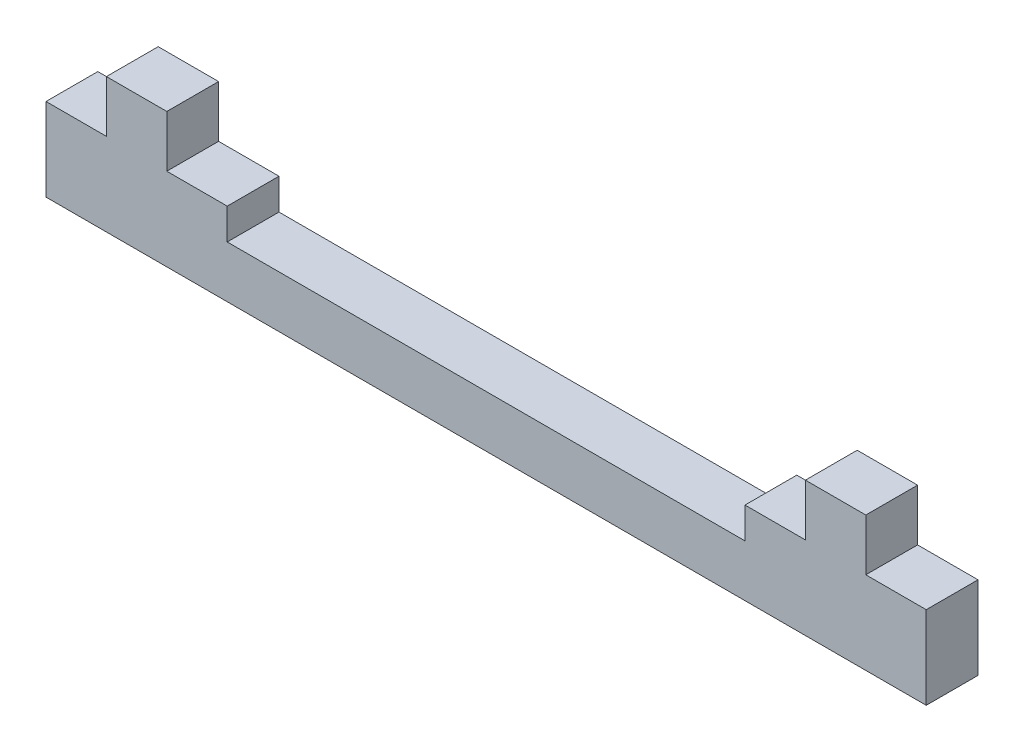
ISO-10303-21;
HEADER;
FILE_DESCRIPTION(('STEP AP214'),'2;1');
FILE_NAME('part.step','',(''),(''),'','','');
FILE_SCHEMA(('AUTOMOTIVE_DESIGN { 1 0 10303 214 1 1 1 1 }'));
ENDSEC;
DATA;
#1=APPLICATION_CONTEXT('core data for automotive mechanical design processes');
#2=APPLICATION_PROTOCOL_DEFINITION('international standard','automotive_design',2000,#1);
#3=PRODUCT_CONTEXT('',#1,'mechanical');
#4=PRODUCT('Part','Part','',(#3));
#5=PRODUCT_RELATED_PRODUCT_CATEGORY('part','',(#4));
#6=PRODUCT_DEFINITION_FORMATION('','',#4);
#7=PRODUCT_DEFINITION_CONTEXT('part definition',#1,'design');
#8=PRODUCT_DEFINITION('design','',#6,#7);
#9=PRODUCT_DEFINITION_SHAPE('','',#8);
#10=(LENGTH_UNIT() NAMED_UNIT(*) SI_UNIT(.MILLI.,.METRE.));
#11=(NAMED_UNIT(*) PLANE_ANGLE_UNIT() SI_UNIT($,.RADIAN.));
#12=(NAMED_UNIT(*) SI_UNIT($,.STERADIAN.) SOLID_ANGLE_UNIT());
#13=UNCERTAINTY_MEASURE_WITH_UNIT(LENGTH_MEASURE(1.E-05),#10,'distance_accuracy_value','');
#14=(GEOMETRIC_REPRESENTATION_CONTEXT(3) GLOBAL_UNCERTAINTY_ASSIGNED_CONTEXT((#13)) GLOBAL_UNIT_ASSIGNED_CONTEXT((#10,
#11,#12)) REPRESENTATION_CONTEXT('',''));
#15=CARTESIAN_POINT('',(0.,0.,0.));
#16=DIRECTION('',(0.,0.,1.));
#17=DIRECTION('',(1.,0.,0.));
#18=AXIS2_PLACEMENT_3D('',#15,#16,#17);
#19=CARTESIAN_POINT('',(-42.5,6.5,5.));
#20=DIRECTION('',(0.,-1.,0.));
#21=DIRECTION('',(0.,0.,-1.));
#22=AXIS2_PLACEMENT_3D('',#19,#20,#21);
#23=PLANE('',#22);
#24=DIRECTION('',(-1.,0.,0.));
#25=VECTOR('',#24,1.);
#26=CARTESIAN_POINT('',(-42.5,6.5,5.));
#27=LINE('',#26,#25);
#28=CARTESIAN_POINT('',(36.666667,6.5,5.));
#29=VERTEX_POINT('',#28);
#30=CARTESIAN_POINT('',(30.833334,6.5,5.));
#31=VERTEX_POINT('',#30);
#32=EDGE_CURVE('E188',#29,#31,#27,.T.);
#33=ORIENTED_EDGE('',*,*,#32,.F.);
#34=DIRECTION('',(0.,0.,-1.));
#35=VECTOR('',#34,1.);
#36=CARTESIAN_POINT('',(36.666667,6.5,5.));
#37=LINE('',#36,#35);
#38=CARTESIAN_POINT('',(36.666667,6.5,0.));
#39=VERTEX_POINT('',#38);
#40=EDGE_CURVE('E229',#29,#39,#37,.T.);
#41=ORIENTED_EDGE('',*,*,#40,.T.);
#42=DIRECTION('',(-1.,0.,0.));
#43=VECTOR('',#42,1.);
#44=CARTESIAN_POINT('',(-42.5,6.5,0.));
#45=LINE('',#44,#43);
#46=CARTESIAN_POINT('',(30.833334,6.5,0.));
#47=VERTEX_POINT('',#46);
#48=EDGE_CURVE('E208',#39,#47,#45,.T.);
#49=ORIENTED_EDGE('',*,*,#48,.T.);
#50=DIRECTION('',(0.,0.,-1.));
#51=VECTOR('',#50,1.);
#52=CARTESIAN_POINT('',(30.833334,6.5,5.));
#53=LINE('',#52,#51);
#54=EDGE_CURVE('E225',#31,#47,#53,.T.);
#55=ORIENTED_EDGE('',*,*,#54,.F.);
#56=EDGE_LOOP('',(#33,#41,#49,#55));
#57=FACE_BOUND('',#56,.T.);
#58=ADVANCED_FACE('F43',(#57),#23,.F.);
#59=CARTESIAN_POINT('',(-30.833334,6.5,5.));
#60=VERTEX_POINT('',#59);
#61=CARTESIAN_POINT('',(-36.666667,6.5,5.));
#62=VERTEX_POINT('',#61);
#63=EDGE_CURVE('E182',#60,#62,#27,.T.);
#64=ORIENTED_EDGE('',*,*,#63,.F.);
#65=DIRECTION('',(0.,0.,-1.));
#66=VECTOR('',#65,1.);
#67=CARTESIAN_POINT('',(-30.833334,6.5,5.));
#68=LINE('',#67,#66);
#69=CARTESIAN_POINT('',(-30.833334,6.5,0.));
#70=VERTEX_POINT('',#69);
#71=EDGE_CURVE('E262',#60,#70,#68,.T.);
#72=ORIENTED_EDGE('',*,*,#71,.T.);
#73=CARTESIAN_POINT('',(-36.666667,6.5,0.));
#74=VERTEX_POINT('',#73);
#75=EDGE_CURVE('E203',#70,#74,#45,.T.);
#76=ORIENTED_EDGE('',*,*,#75,.T.);
#77=DIRECTION('',(0.,0.,-1.));
#78=VECTOR('',#77,1.);
#79=CARTESIAN_POINT('',(-36.666667,6.5,5.));
#80=LINE('',#79,#78);
#81=EDGE_CURVE('E282',#62,#74,#80,.T.);
#82=ORIENTED_EDGE('',*,*,#81,.F.);
#83=EDGE_LOOP('',(#64,#72,#76,#82));
#84=FACE_BOUND('',#83,.T.);
#85=ADVANCED_FACE('F352',(#84),#23,.F.);
#86=CARTESIAN_POINT('',(-42.5,6.5,5.));
#87=DIRECTION('',(1.,0.,0.));
#88=DIRECTION('',(0.,0.,-1.));
#89=AXIS2_PLACEMENT_3D('',#86,#87,#88);
#90=PLANE('',#89);
#91=DIRECTION('',(0.,0.,-1.));
#92=VECTOR('',#91,1.);
#93=CARTESIAN_POINT('',(-42.5,1.5,5.));
#94=LINE('',#93,#92);
#95=CARTESIAN_POINT('',(-42.5,1.5,5.));
#96=VERTEX_POINT('',#95);
#97=CARTESIAN_POINT('',(-42.5,1.5,0.));
#98=VERTEX_POINT('',#97);
#99=EDGE_CURVE('E285',#96,#98,#94,.T.);
#100=ORIENTED_EDGE('',*,*,#99,.T.);
#101=DIRECTION('',(0.,-1.,0.));
#102=VECTOR('',#101,1.);
#103=CARTESIAN_POINT('',(-42.5,6.5,0.));
#104=LINE('',#103,#102);
#105=CARTESIAN_POINT('',(-42.5,-6.5,0.));
#106=VERTEX_POINT('',#105);
#107=EDGE_CURVE('E190',#98,#106,#104,.T.);
#108=ORIENTED_EDGE('',*,*,#107,.T.);
#109=DIRECTION('',(0.,0.,-1.));
#110=VECTOR('',#109,1.);
#111=CARTESIAN_POINT('',(-42.5,-6.5,5.));
#112=LINE('',#111,#110);
#113=CARTESIAN_POINT('',(-42.5,-6.5,5.));
#114=VERTEX_POINT('',#113);
#115=EDGE_CURVE('E11',#114,#106,#112,.T.);
#116=ORIENTED_EDGE('',*,*,#115,.F.);
#117=DIRECTION('',(0.,-1.,0.));
#118=VECTOR('',#117,1.);
#119=CARTESIAN_POINT('',(-42.5,6.5,5.));
#120=LINE('',#119,#118);
#121=EDGE_CURVE('E196',#96,#114,#120,.T.);
#122=ORIENTED_EDGE('',*,*,#121,.F.);
#123=EDGE_LOOP('',(#100,#108,#116,#122));
#124=FACE_BOUND('',#123,.T.);
#125=ADVANCED_FACE('F360',(#124),#90,.F.);
#126=CARTESIAN_POINT('',(0.,0.,5.));
#127=DIRECTION('',(0.,0.,1.));
#128=DIRECTION('',(1.,0.,0.));
#129=AXIS2_PLACEMENT_3D('',#126,#127,#128);
#130=PLANE('',#129);
#131=DIRECTION('',(0.,1.,0.));
#132=VECTOR('',#131,1.);
#133=CARTESIAN_POINT('',(36.666667,0.,5.));
#134=LINE('',#133,#132);
#135=CARTESIAN_POINT('',(36.666667,1.5,5.));
#136=VERTEX_POINT('',#135);
#137=EDGE_CURVE('E165',#136,#29,#134,.T.);
#138=ORIENTED_EDGE('',*,*,#137,.T.);
#139=ORIENTED_EDGE('',*,*,#32,.T.);
#140=DIRECTION('',(0.,1.,0.));
#141=VECTOR('',#140,1.);
#142=CARTESIAN_POINT('',(30.833334,0.,5.));
#143=LINE('',#142,#141);
#144=CARTESIAN_POINT('',(30.833334,1.5,5.));
#145=VERTEX_POINT('',#144);
#146=EDGE_CURVE('E245',#145,#31,#143,.T.);
#147=ORIENTED_EDGE('',*,*,#146,.F.);
#148=DIRECTION('',(-1.,0.,0.));
#149=VECTOR('',#148,1.);
#150=CARTESIAN_POINT('',(0.,1.5,5.));
#151=LINE('',#150,#149);
#152=CARTESIAN_POINT('',(25.,1.5,5.));
#153=VERTEX_POINT('',#152);
#154=EDGE_CURVE('E236',#145,#153,#151,.T.);
#155=ORIENTED_EDGE('',*,*,#154,.T.);
#156=DIRECTION('',(0.,1.,0.));
#157=VECTOR('',#156,1.);
#158=CARTESIAN_POINT('',(25.,1.5,5.));
#159=LINE('',#158,#157);
#160=CARTESIAN_POINT('',(25.,-1.5,5.));
#161=VERTEX_POINT('',#160);
#162=EDGE_CURVE('E296',#161,#153,#159,.T.);
#163=ORIENTED_EDGE('',*,*,#162,.F.);
#164=DIRECTION('',(1.,0.,0.));
#165=VECTOR('',#164,1.);
#166=CARTESIAN_POINT('',(-25.,-1.5,5.));
#167=LINE('',#166,#165);
#168=CARTESIAN_POINT('',(-25.,-1.5,5.));
#169=VERTEX_POINT('',#168);
#170=EDGE_CURVE('E306',#169,#161,#167,.T.);
#171=ORIENTED_EDGE('',*,*,#170,.F.);
#172=DIRECTION('',(0.,-1.,0.));
#173=VECTOR('',#172,1.);
#174=CARTESIAN_POINT('',(-25.,1.5,5.));
#175=LINE('',#174,#173);
#176=CARTESIAN_POINT('',(-25.,1.5,5.));
#177=VERTEX_POINT('',#176);
#178=EDGE_CURVE('E233',#177,#169,#175,.T.);
#179=ORIENTED_EDGE('',*,*,#178,.F.);
#180=CARTESIAN_POINT('',(-30.833334,1.5,5.));
#181=VERTEX_POINT('',#180);
#182=EDGE_CURVE('E241',#177,#181,#151,.T.);
#183=ORIENTED_EDGE('',*,*,#182,.T.);
#184=DIRECTION('',(0.,1.,0.));
#185=VECTOR('',#184,1.);
#186=CARTESIAN_POINT('',(-30.833334,0.,5.));
#187=LINE('',#186,#185);
#188=EDGE_CURVE('E240',#181,#60,#187,.T.);
#189=ORIENTED_EDGE('',*,*,#188,.T.);
#190=ORIENTED_EDGE('',*,*,#63,.T.);
#191=DIRECTION('',(0.,1.,0.));
#192=VECTOR('',#191,1.);
#193=CARTESIAN_POINT('',(-36.666667,0.,5.));
#194=LINE('',#193,#192);
#195=CARTESIAN_POINT('',(-36.666667,1.5,5.));
#196=VERTEX_POINT('',#195);
#197=EDGE_CURVE('E269',#196,#62,#194,.T.);
#198=ORIENTED_EDGE('',*,*,#197,.F.);
#199=DIRECTION('',(1.,0.,0.));
#200=VECTOR('',#199,1.);
#201=CARTESIAN_POINT('',(0.,1.5,5.));
#202=LINE('',#201,#200);
#203=EDGE_CURVE('E272',#96,#196,#202,.T.);
#204=ORIENTED_EDGE('',*,*,#203,.F.);
#205=ORIENTED_EDGE('',*,*,#121,.T.);
#206=DIRECTION('',(1.,0.,0.));
#207=VECTOR('',#206,1.);
#208=CARTESIAN_POINT('',(-42.5,-6.5,5.));
#209=LINE('',#208,#207);
#210=CARTESIAN_POINT('',(42.5,-6.5,5.));
#211=VERTEX_POINT('',#210);
#212=EDGE_CURVE('E179',#114,#211,#209,.T.);
#213=ORIENTED_EDGE('',*,*,#212,.T.);
#214=DIRECTION('',(0.,1.,0.));
#215=VECTOR('',#214,1.);
#216=CARTESIAN_POINT('',(42.5,6.5,5.));
#217=LINE('',#216,#215);
#218=CARTESIAN_POINT('',(42.5,1.5,5.));
#219=VERTEX_POINT('',#218);
#220=EDGE_CURVE('E172',#211,#219,#217,.T.);
#221=ORIENTED_EDGE('',*,*,#220,.T.);
#222=DIRECTION('',(-1.,0.,0.));
#223=VECTOR('',#222,1.);
#224=CARTESIAN_POINT('',(0.,1.5,5.));
#225=LINE('',#224,#223);
#226=EDGE_CURVE('E157',#219,#136,#225,.T.);
#227=ORIENTED_EDGE('',*,*,#226,.T.);
#228=EDGE_LOOP('',(#138,#139,#147,#155,#163,#171,#179,#183,#189,#190,#198,#204,#205,#213,#221,#227));
#229=FACE_BOUND('',#228,.T.);
#230=ADVANCED_FACE('F177',(#229),#130,.T.);
#231=CARTESIAN_POINT('',(0.,0.,0.));
#232=DIRECTION('',(0.,0.,1.));
#233=DIRECTION('',(1.,0.,0.));
#234=AXIS2_PLACEMENT_3D('',#231,#232,#233);
#235=PLANE('',#234);
#236=ORIENTED_EDGE('',*,*,#48,.F.);
#237=DIRECTION('',(0.,1.,0.));
#238=VECTOR('',#237,1.);
#239=CARTESIAN_POINT('',(36.666667,0.,0.));
#240=LINE('',#239,#238);
#241=CARTESIAN_POINT('',(36.666667,1.5,0.));
#242=VERTEX_POINT('',#241);
#243=EDGE_CURVE('E166',#242,#39,#240,.T.);
#244=ORIENTED_EDGE('',*,*,#243,.F.);
#245=DIRECTION('',(-1.,0.,0.));
#246=VECTOR('',#245,1.);
#247=CARTESIAN_POINT('',(0.,1.5,0.));
#248=LINE('',#247,#246);
#249=CARTESIAN_POINT('',(42.5,1.5,0.));
#250=VERTEX_POINT('',#249);
#251=EDGE_CURVE('E218',#250,#242,#248,.T.);
#252=ORIENTED_EDGE('',*,*,#251,.F.);
#253=DIRECTION('',(0.,1.,0.));
#254=VECTOR('',#253,1.);
#255=CARTESIAN_POINT('',(42.5,6.5,0.));
#256=LINE('',#255,#254);
#257=CARTESIAN_POINT('',(42.5,-6.5,0.));
#258=VERTEX_POINT('',#257);
#259=EDGE_CURVE('E174',#258,#250,#256,.T.);
#260=ORIENTED_EDGE('',*,*,#259,.F.);
#261=DIRECTION('',(1.,0.,0.));
#262=VECTOR('',#261,1.);
#263=CARTESIAN_POINT('',(-42.5,-6.5,0.));
#264=LINE('',#263,#262);
#265=EDGE_CURVE('E183',#106,#258,#264,.T.);
#266=ORIENTED_EDGE('',*,*,#265,.F.);
#267=ORIENTED_EDGE('',*,*,#107,.F.);
#268=DIRECTION('',(1.,0.,0.));
#269=VECTOR('',#268,1.);
#270=CARTESIAN_POINT('',(0.,1.5,0.));
#271=LINE('',#270,#269);
#272=CARTESIAN_POINT('',(-36.666667,1.5,0.));
#273=VERTEX_POINT('',#272);
#274=EDGE_CURVE('E273',#98,#273,#271,.T.);
#275=ORIENTED_EDGE('',*,*,#274,.T.);
#276=DIRECTION('',(0.,1.,0.));
#277=VECTOR('',#276,1.);
#278=CARTESIAN_POINT('',(-36.666667,0.,0.));
#279=LINE('',#278,#277);
#280=EDGE_CURVE('E59',#273,#74,#279,.T.);
#281=ORIENTED_EDGE('',*,*,#280,.T.);
#282=ORIENTED_EDGE('',*,*,#75,.F.);
#283=DIRECTION('',(0.,1.,0.));
#284=VECTOR('',#283,1.);
#285=CARTESIAN_POINT('',(-30.833334,0.,0.));
#286=LINE('',#285,#284);
#287=CARTESIAN_POINT('',(-30.833334,1.5,0.));
#288=VERTEX_POINT('',#287);
#289=EDGE_CURVE('E252',#288,#70,#286,.T.);
#290=ORIENTED_EDGE('',*,*,#289,.F.);
#291=DIRECTION('',(-1.,0.,0.));
#292=VECTOR('',#291,1.);
#293=CARTESIAN_POINT('',(0.,1.5,0.));
#294=LINE('',#293,#292);
#295=CARTESIAN_POINT('',(-25.,1.5,0.));
#296=VERTEX_POINT('',#295);
#297=EDGE_CURVE('E253',#296,#288,#294,.T.);
#298=ORIENTED_EDGE('',*,*,#297,.F.);
#299=DIRECTION('',(0.,-1.,0.));
#300=VECTOR('',#299,1.);
#301=CARTESIAN_POINT('',(-25.,1.5,0.));
#302=LINE('',#301,#300);
#303=CARTESIAN_POINT('',(-25.,-1.5,0.));
#304=VERTEX_POINT('',#303);
#305=EDGE_CURVE('E291',#296,#304,#302,.T.);
#306=ORIENTED_EDGE('',*,*,#305,.T.);
#307=DIRECTION('',(1.,0.,0.));
#308=VECTOR('',#307,1.);
#309=CARTESIAN_POINT('',(-25.,-1.5,0.));
#310=LINE('',#309,#308);
#311=CARTESIAN_POINT('',(25.,-1.5,0.));
#312=VERTEX_POINT('',#311);
#313=EDGE_CURVE('E295',#304,#312,#310,.T.);
#314=ORIENTED_EDGE('',*,*,#313,.T.);
#315=DIRECTION('',(0.,1.,0.));
#316=VECTOR('',#315,1.);
#317=CARTESIAN_POINT('',(25.,1.5,0.));
#318=LINE('',#317,#316);
#319=CARTESIAN_POINT('',(25.,1.5,0.));
#320=VERTEX_POINT('',#319);
#321=EDGE_CURVE('E300',#312,#320,#318,.T.);
#322=ORIENTED_EDGE('',*,*,#321,.T.);
#323=CARTESIAN_POINT('',(30.833334,1.5,0.));
#324=VERTEX_POINT('',#323);
#325=EDGE_CURVE('E249',#324,#320,#294,.T.);
#326=ORIENTED_EDGE('',*,*,#325,.F.);
#327=DIRECTION('',(0.,1.,0.));
#328=VECTOR('',#327,1.);
#329=CARTESIAN_POINT('',(30.833334,0.,0.));
#330=LINE('',#329,#328);
#331=EDGE_CURVE('E256',#324,#47,#330,.T.);
#332=ORIENTED_EDGE('',*,*,#331,.T.);
#333=EDGE_LOOP('',(#236,#244,#252,#260,#266,#267,#275,#281,#282,#290,#298,#306,#314,#322,#326,#332));
#334=FACE_BOUND('',#333,.T.);
#335=ADVANCED_FACE('F215',(#334),#235,.F.);
#336=CARTESIAN_POINT('',(42.5,6.5,5.));
#337=DIRECTION('',(-1.,0.,0.));
#338=DIRECTION('',(0.,-1.,0.));
#339=AXIS2_PLACEMENT_3D('',#336,#337,#338);
#340=PLANE('',#339);
#341=ORIENTED_EDGE('',*,*,#259,.T.);
#342=DIRECTION('',(0.,0.,-1.));
#343=VECTOR('',#342,1.);
#344=CARTESIAN_POINT('',(42.5,1.5,5.));
#345=LINE('',#344,#343);
#346=EDGE_CURVE('E67',#219,#250,#345,.T.);
#347=ORIENTED_EDGE('',*,*,#346,.F.);
#348=ORIENTED_EDGE('',*,*,#220,.F.);
#349=DIRECTION('',(0.,0.,-1.));
#350=VECTOR('',#349,1.);
#351=CARTESIAN_POINT('',(42.5,-6.5,5.));
#352=LINE('',#351,#350);
#353=EDGE_CURVE('E52',#211,#258,#352,.T.);
#354=ORIENTED_EDGE('',*,*,#353,.T.);
#355=EDGE_LOOP('',(#341,#347,#348,#354));
#356=FACE_BOUND('',#355,.T.);
#357=ADVANCED_FACE('F45',(#356),#340,.F.);
#358=CARTESIAN_POINT('',(-42.5,-6.5,5.));
#359=DIRECTION('',(0.,1.,0.));
#360=DIRECTION('',(0.,0.,1.));
#361=AXIS2_PLACEMENT_3D('',#358,#359,#360);
#362=PLANE('',#361);
#363=ORIENTED_EDGE('',*,*,#265,.T.);
#364=ORIENTED_EDGE('',*,*,#353,.F.);
#365=ORIENTED_EDGE('',*,*,#212,.F.);
#366=ORIENTED_EDGE('',*,*,#115,.T.);
#367=EDGE_LOOP('',(#363,#364,#365,#366));
#368=FACE_BOUND('',#367,.T.);
#369=ADVANCED_FACE('F362',(#368),#362,.F.);
#370=CARTESIAN_POINT('',(-25.,1.5,0.));
#371=DIRECTION('',(-1.,0.,0.));
#372=DIRECTION('',(0.,0.,1.));
#373=AXIS2_PLACEMENT_3D('',#370,#371,#372);
#374=PLANE('',#373);
#375=ORIENTED_EDGE('',*,*,#178,.T.);
#376=DIRECTION('',(0.,0.,1.));
#377=VECTOR('',#376,1.);
#378=CARTESIAN_POINT('',(-25.,-1.5,0.));
#379=LINE('',#378,#377);
#380=EDGE_CURVE('E193',#304,#169,#379,.T.);
#381=ORIENTED_EDGE('',*,*,#380,.F.);
#382=ORIENTED_EDGE('',*,*,#305,.F.);
#383=DIRECTION('',(0.,0.,1.));
#384=VECTOR('',#383,1.);
#385=CARTESIAN_POINT('',(-25.,1.5,0.));
#386=LINE('',#385,#384);
#387=EDGE_CURVE('E204',#296,#177,#386,.T.);
#388=ORIENTED_EDGE('',*,*,#387,.T.);
#389=EDGE_LOOP('',(#375,#381,#382,#388));
#390=FACE_BOUND('',#389,.T.);
#391=ADVANCED_FACE('F341',(#390),#374,.F.);
#392=CARTESIAN_POINT('',(25.,1.5,0.));
#393=DIRECTION('',(1.,0.,0.));
#394=DIRECTION('',(0.,0.,-1.));
#395=AXIS2_PLACEMENT_3D('',#392,#393,#394);
#396=PLANE('',#395);
#397=ORIENTED_EDGE('',*,*,#162,.T.);
#398=DIRECTION('',(0.,0.,1.));
#399=VECTOR('',#398,1.);
#400=CARTESIAN_POINT('',(25.,1.5,0.));
#401=LINE('',#400,#399);
#402=EDGE_CURVE('E316',#320,#153,#401,.T.);
#403=ORIENTED_EDGE('',*,*,#402,.F.);
#404=ORIENTED_EDGE('',*,*,#321,.F.);
#405=DIRECTION('',(0.,0.,1.));
#406=VECTOR('',#405,1.);
#407=CARTESIAN_POINT('',(25.,-1.5,0.));
#408=LINE('',#407,#406);
#409=EDGE_CURVE('E318',#312,#161,#408,.T.);
#410=ORIENTED_EDGE('',*,*,#409,.T.);
#411=EDGE_LOOP('',(#397,#403,#404,#410));
#412=FACE_BOUND('',#411,.T.);
#413=ADVANCED_FACE('F336',(#412),#396,.F.);
#414=CARTESIAN_POINT('',(-25.,-1.5,0.));
#415=DIRECTION('',(0.,-1.,0.));
#416=DIRECTION('',(0.,0.,-1.));
#417=AXIS2_PLACEMENT_3D('',#414,#415,#416);
#418=PLANE('',#417);
#419=ORIENTED_EDGE('',*,*,#170,.T.);
#420=ORIENTED_EDGE('',*,*,#409,.F.);
#421=ORIENTED_EDGE('',*,*,#313,.F.);
#422=ORIENTED_EDGE('',*,*,#380,.T.);
#423=EDGE_LOOP('',(#419,#420,#421,#422));
#424=FACE_BOUND('',#423,.T.);
#425=ADVANCED_FACE('F327',(#424),#418,.F.);
#426=CARTESIAN_POINT('',(0.,1.5,5.));
#427=DIRECTION('',(0.,-1.,0.));
#428=DIRECTION('',(0.,0.,-1.));
#429=AXIS2_PLACEMENT_3D('',#426,#427,#428);
#430=PLANE('',#429);
#431=ORIENTED_EDGE('',*,*,#154,.F.);
#432=DIRECTION('',(0.,0.,-1.));
#433=VECTOR('',#432,1.);
#434=CARTESIAN_POINT('',(30.833334,1.5,5.));
#435=LINE('',#434,#433);
#436=EDGE_CURVE('E220',#145,#324,#435,.T.);
#437=ORIENTED_EDGE('',*,*,#436,.T.);
#438=ORIENTED_EDGE('',*,*,#325,.T.);
#439=ORIENTED_EDGE('',*,*,#402,.T.);
#440=EDGE_LOOP('',(#431,#437,#438,#439));
#441=FACE_BOUND('',#440,.T.);
#442=ADVANCED_FACE('F389',(#441),#430,.F.);
#443=CARTESIAN_POINT('',(30.833334,0.,5.));
#444=DIRECTION('',(-1.,0.,0.));
#445=DIRECTION('',(0.,-1.,0.));
#446=AXIS2_PLACEMENT_3D('',#443,#444,#445);
#447=PLANE('',#446);
#448=ORIENTED_EDGE('',*,*,#331,.F.);
#449=ORIENTED_EDGE('',*,*,#436,.F.);
#450=ORIENTED_EDGE('',*,*,#146,.T.);
#451=ORIENTED_EDGE('',*,*,#54,.T.);
#452=EDGE_LOOP('',(#448,#449,#450,#451));
#453=FACE_BOUND('',#452,.T.);
#454=ADVANCED_FACE('F400',(#453),#447,.T.);
#455=ORIENTED_EDGE('',*,*,#297,.T.);
#456=DIRECTION('',(0.,0.,-1.));
#457=VECTOR('',#456,1.);
#458=CARTESIAN_POINT('',(-30.833334,1.5,5.));
#459=LINE('',#458,#457);
#460=EDGE_CURVE('E248',#181,#288,#459,.T.);
#461=ORIENTED_EDGE('',*,*,#460,.F.);
#462=ORIENTED_EDGE('',*,*,#182,.F.);
#463=ORIENTED_EDGE('',*,*,#387,.F.);
#464=EDGE_LOOP('',(#455,#461,#462,#463));
#465=FACE_BOUND('',#464,.T.);
#466=ADVANCED_FACE('F343',(#465),#430,.F.);
#467=CARTESIAN_POINT('',(-30.833334,0.,5.));
#468=DIRECTION('',(-1.,0.,0.));
#469=DIRECTION('',(0.,-1.,0.));
#470=AXIS2_PLACEMENT_3D('',#467,#468,#469);
#471=PLANE('',#470);
#472=ORIENTED_EDGE('',*,*,#289,.T.);
#473=ORIENTED_EDGE('',*,*,#71,.F.);
#474=ORIENTED_EDGE('',*,*,#188,.F.);
#475=ORIENTED_EDGE('',*,*,#460,.T.);
#476=EDGE_LOOP('',(#472,#473,#474,#475));
#477=FACE_BOUND('',#476,.T.);
#478=ADVANCED_FACE('F394',(#477),#471,.F.);
#479=CARTESIAN_POINT('',(-36.666667,0.,5.));
#480=DIRECTION('',(-1.,0.,0.));
#481=DIRECTION('',(0.,-1.,0.));
#482=AXIS2_PLACEMENT_3D('',#479,#480,#481);
#483=PLANE('',#482);
#484=ORIENTED_EDGE('',*,*,#280,.F.);
#485=DIRECTION('',(0.,0.,-1.));
#486=VECTOR('',#485,1.);
#487=CARTESIAN_POINT('',(-36.666667,1.5,5.));
#488=LINE('',#487,#486);
#489=EDGE_CURVE('E276',#196,#273,#488,.T.);
#490=ORIENTED_EDGE('',*,*,#489,.F.);
#491=ORIENTED_EDGE('',*,*,#197,.T.);
#492=ORIENTED_EDGE('',*,*,#81,.T.);
#493=EDGE_LOOP('',(#484,#490,#491,#492));
#494=FACE_BOUND('',#493,.T.);
#495=ADVANCED_FACE('F354',(#494),#483,.T.);
#496=CARTESIAN_POINT('',(0.,1.5,5.));
#497=DIRECTION('',(0.,1.,0.));
#498=DIRECTION('',(0.,0.,1.));
#499=AXIS2_PLACEMENT_3D('',#496,#497,#498);
#500=PLANE('',#499);
#501=ORIENTED_EDGE('',*,*,#274,.F.);
#502=ORIENTED_EDGE('',*,*,#99,.F.);
#503=ORIENTED_EDGE('',*,*,#203,.T.);
#504=ORIENTED_EDGE('',*,*,#489,.T.);
#505=EDGE_LOOP('',(#501,#502,#503,#504));
#506=FACE_BOUND('',#505,.T.);
#507=ADVANCED_FACE('F356',(#506),#500,.T.);
#508=CARTESIAN_POINT('',(36.666667,0.,5.));
#509=DIRECTION('',(-1.,0.,0.));
#510=DIRECTION('',(0.,-1.,0.));
#511=AXIS2_PLACEMENT_3D('',#508,#509,#510);
#512=PLANE('',#511);
#513=ORIENTED_EDGE('',*,*,#243,.T.);
#514=ORIENTED_EDGE('',*,*,#40,.F.);
#515=ORIENTED_EDGE('',*,*,#137,.F.);
#516=DIRECTION('',(0.,0.,-1.));
#517=VECTOR('',#516,1.);
#518=CARTESIAN_POINT('',(36.666667,1.5,5.));
#519=LINE('',#518,#517);
#520=EDGE_CURVE('E159',#136,#242,#519,.T.);
#521=ORIENTED_EDGE('',*,*,#520,.T.);
#522=EDGE_LOOP('',(#513,#514,#515,#521));
#523=FACE_BOUND('',#522,.T.);
#524=ADVANCED_FACE('F397',(#523),#512,.F.);
#525=CARTESIAN_POINT('',(0.,1.5,5.));
#526=DIRECTION('',(0.,-1.,0.));
#527=DIRECTION('',(0.,0.,-1.));
#528=AXIS2_PLACEMENT_3D('',#525,#526,#527);
#529=PLANE('',#528);
#530=ORIENTED_EDGE('',*,*,#251,.T.);
#531=ORIENTED_EDGE('',*,*,#520,.F.);
#532=ORIENTED_EDGE('',*,*,#226,.F.);
#533=ORIENTED_EDGE('',*,*,#346,.T.);
#534=EDGE_LOOP('',(#530,#531,#532,#533));
#535=FACE_BOUND('',#534,.T.);
#536=ADVANCED_FACE('F158',(#535),#529,.F.);
#537=CLOSED_SHELL('',(#58,#85,#125,#230,#335,#357,#369,#391,#413,#425,#442,#454,#466,#478,#495,
#507,#524,#536));
#538=MANIFOLD_SOLID_BREP('B2',#537);
#539=ADVANCED_BREP_SHAPE_REPRESENTATION('',(#18,#538),#14);
#540=SHAPE_DEFINITION_REPRESENTATION(#9,#539);
ENDSEC;
END-ISO-10303-21;
